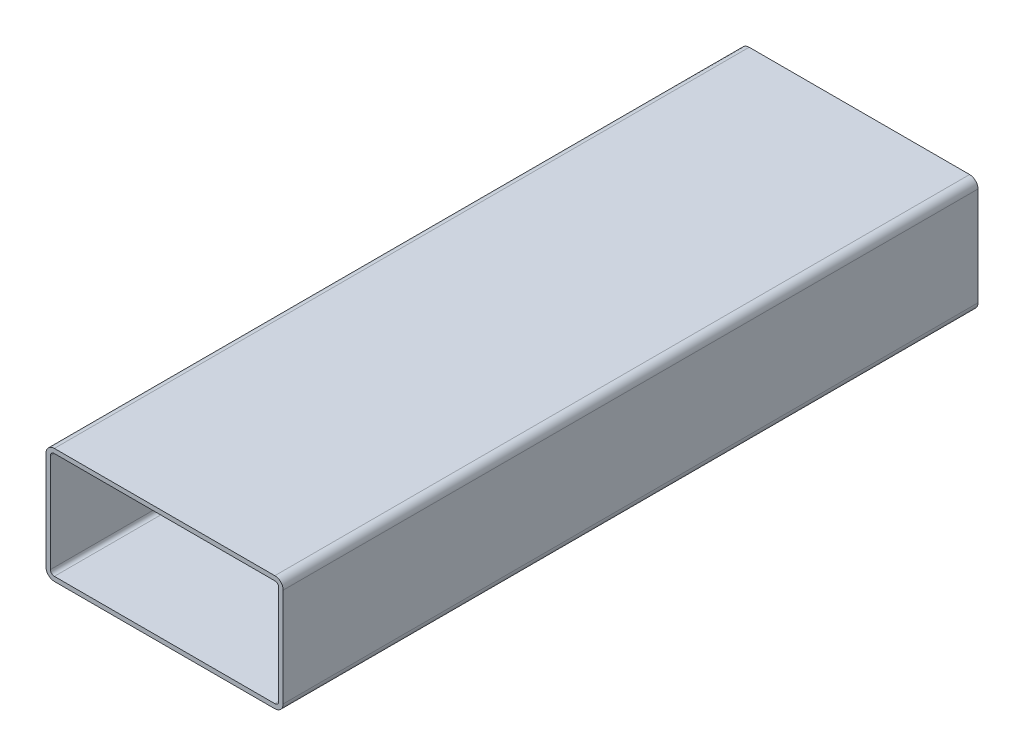
ISO-10303-21;
HEADER;
FILE_DESCRIPTION(('STEP AP214'),'2;1');
FILE_NAME('part.step','',(''),(''),'','','');
FILE_SCHEMA(('AUTOMOTIVE_DESIGN { 1 0 10303 214 1 1 1 1 }'));
ENDSEC;
DATA;
#1=APPLICATION_CONTEXT('core data for automotive mechanical design processes');
#2=APPLICATION_PROTOCOL_DEFINITION('international standard','automotive_design',2000,#1);
#3=PRODUCT_CONTEXT('',#1,'mechanical');
#4=PRODUCT('Part','Part','',(#3));
#5=PRODUCT_RELATED_PRODUCT_CATEGORY('part','',(#4));
#6=PRODUCT_DEFINITION_FORMATION('','',#4);
#7=PRODUCT_DEFINITION_CONTEXT('part definition',#1,'design');
#8=PRODUCT_DEFINITION('design','',#6,#7);
#9=PRODUCT_DEFINITION_SHAPE('','',#8);
#10=(LENGTH_UNIT() NAMED_UNIT(*) SI_UNIT(.MILLI.,.METRE.));
#11=(NAMED_UNIT(*) PLANE_ANGLE_UNIT() SI_UNIT($,.RADIAN.));
#12=(NAMED_UNIT(*) SI_UNIT($,.STERADIAN.) SOLID_ANGLE_UNIT());
#13=UNCERTAINTY_MEASURE_WITH_UNIT(LENGTH_MEASURE(1.E-05),#10,'distance_accuracy_value','');
#14=(GEOMETRIC_REPRESENTATION_CONTEXT(3) GLOBAL_UNCERTAINTY_ASSIGNED_CONTEXT((#13)) GLOBAL_UNIT_ASSIGNED_CONTEXT((#10,
#11,#12)) REPRESENTATION_CONTEXT('',''));
#15=CARTESIAN_POINT('',(0.,0.,0.));
#16=DIRECTION('',(0.,0.,1.));
#17=DIRECTION('',(1.,0.,0.));
#18=AXIS2_PLACEMENT_3D('',#15,#16,#17);
#19=CARTESIAN_POINT('',(33.,-14.75,-208.));
#20=DIRECTION('',(0.,0.,1.));
#21=DIRECTION('',(1.,0.,0.));
#22=AXIS2_PLACEMENT_3D('',#19,#20,#21);
#23=CYLINDRICAL_SURFACE('',#22,2.5);
#24=CARTESIAN_POINT('',(33.,-14.75,0.));
#25=DIRECTION('',(0.,0.,1.));
#26=DIRECTION('',(1.,0.,0.));
#27=AXIS2_PLACEMENT_3D('',#24,#25,#26);
#28=CIRCLE('',#27,2.5);
#29=CARTESIAN_POINT('',(33.,-17.25,0.));
#30=VERTEX_POINT('',#29);
#31=CARTESIAN_POINT('',(35.5,-14.75,0.));
#32=VERTEX_POINT('',#31);
#33=EDGE_CURVE('E232',#30,#32,#28,.T.);
#34=ORIENTED_EDGE('',*,*,#33,.F.);
#35=DIRECTION('',(0.,0.,1.));
#36=VECTOR('',#35,1.);
#37=CARTESIAN_POINT('',(33.,-17.25,-208.));
#38=LINE('',#37,#36);
#39=CARTESIAN_POINT('',(33.,-17.25,-208.));
#40=VERTEX_POINT('',#39);
#41=EDGE_CURVE('E11',#40,#30,#38,.T.);
#42=ORIENTED_EDGE('',*,*,#41,.F.);
#43=CARTESIAN_POINT('',(33.,-14.75,-208.));
#44=DIRECTION('',(0.,0.,1.));
#45=DIRECTION('',(1.,0.,0.));
#46=AXIS2_PLACEMENT_3D('',#43,#44,#45);
#47=CIRCLE('',#46,2.5);
#48=CARTESIAN_POINT('',(35.5,-14.75,-208.));
#49=VERTEX_POINT('',#48);
#50=EDGE_CURVE('E207',#40,#49,#47,.T.);
#51=ORIENTED_EDGE('',*,*,#50,.T.);
#52=DIRECTION('',(0.,0.,1.));
#53=VECTOR('',#52,1.);
#54=CARTESIAN_POINT('',(35.5,-14.75,-208.));
#55=LINE('',#54,#53);
#56=EDGE_CURVE('E36',#49,#32,#55,.T.);
#57=ORIENTED_EDGE('',*,*,#56,.T.);
#58=EDGE_LOOP('',(#34,#42,#51,#57));
#59=FACE_BOUND('',#58,.T.);
#60=ADVANCED_FACE('F33',(#59),#23,.T.);
#61=CARTESIAN_POINT('',(-33.,-17.25,-208.));
#62=DIRECTION('',(0.,-1.,0.));
#63=DIRECTION('',(0.,0.,-1.));
#64=AXIS2_PLACEMENT_3D('',#61,#62,#63);
#65=PLANE('',#64);
#66=DIRECTION('',(1.,0.,0.));
#67=VECTOR('',#66,1.);
#68=CARTESIAN_POINT('',(-33.,-17.25,0.));
#69=LINE('',#68,#67);
#70=CARTESIAN_POINT('',(-33.,-17.25,0.));
#71=VERTEX_POINT('',#70);
#72=EDGE_CURVE('E211',#71,#30,#69,.T.);
#73=ORIENTED_EDGE('',*,*,#72,.F.);
#74=DIRECTION('',(0.,0.,1.));
#75=VECTOR('',#74,1.);
#76=CARTESIAN_POINT('',(-33.,-17.25,-208.));
#77=LINE('',#76,#75);
#78=CARTESIAN_POINT('',(-33.,-17.25,-208.));
#79=VERTEX_POINT('',#78);
#80=EDGE_CURVE('E41',#79,#71,#77,.T.);
#81=ORIENTED_EDGE('',*,*,#80,.F.);
#82=DIRECTION('',(1.,0.,0.));
#83=VECTOR('',#82,1.);
#84=CARTESIAN_POINT('',(-33.,-17.25,-208.));
#85=LINE('',#84,#83);
#86=EDGE_CURVE('E229',#79,#40,#85,.T.);
#87=ORIENTED_EDGE('',*,*,#86,.T.);
#88=ORIENTED_EDGE('',*,*,#41,.T.);
#89=EDGE_LOOP('',(#73,#81,#87,#88));
#90=FACE_BOUND('',#89,.T.);
#91=ADVANCED_FACE('F275',(#90),#65,.T.);
#92=CARTESIAN_POINT('',(-33.,-14.75,-208.));
#93=DIRECTION('',(0.,0.,1.));
#94=DIRECTION('',(1.,0.,0.));
#95=AXIS2_PLACEMENT_3D('',#92,#93,#94);
#96=CYLINDRICAL_SURFACE('',#95,2.5);
#97=CARTESIAN_POINT('',(-33.,-14.75,0.));
#98=DIRECTION('',(0.,0.,1.));
#99=DIRECTION('',(-1.,0.,0.));
#100=AXIS2_PLACEMENT_3D('',#97,#98,#99);
#101=CIRCLE('',#100,2.5);
#102=CARTESIAN_POINT('',(-35.5,-14.75,0.));
#103=VERTEX_POINT('',#102);
#104=EDGE_CURVE('E250',#103,#71,#101,.T.);
#105=ORIENTED_EDGE('',*,*,#104,.F.);
#106=DIRECTION('',(0.,0.,1.));
#107=VECTOR('',#106,1.);
#108=CARTESIAN_POINT('',(-35.5,-14.75,-208.));
#109=LINE('',#108,#107);
#110=CARTESIAN_POINT('',(-35.5,-14.75,-208.));
#111=VERTEX_POINT('',#110);
#112=EDGE_CURVE('E256',#111,#103,#109,.T.);
#113=ORIENTED_EDGE('',*,*,#112,.F.);
#114=CARTESIAN_POINT('',(-33.,-14.75,-208.));
#115=DIRECTION('',(0.,0.,1.));
#116=DIRECTION('',(-1.,0.,0.));
#117=AXIS2_PLACEMENT_3D('',#114,#115,#116);
#118=CIRCLE('',#117,2.5);
#119=EDGE_CURVE('E226',#111,#79,#118,.T.);
#120=ORIENTED_EDGE('',*,*,#119,.T.);
#121=ORIENTED_EDGE('',*,*,#80,.T.);
#122=EDGE_LOOP('',(#105,#113,#120,#121));
#123=FACE_BOUND('',#122,.T.);
#124=ADVANCED_FACE('F296',(#123),#96,.T.);
#125=CARTESIAN_POINT('',(-35.5,-14.75,-208.));
#126=DIRECTION('',(-1.,0.,0.));
#127=DIRECTION('',(0.,0.,1.));
#128=AXIS2_PLACEMENT_3D('',#125,#126,#127);
#129=PLANE('',#128);
#130=DIRECTION('',(0.,-1.,0.));
#131=VECTOR('',#130,1.);
#132=CARTESIAN_POINT('',(-35.5,-14.75,0.));
#133=LINE('',#132,#131);
#134=CARTESIAN_POINT('',(-35.5,14.75,0.));
#135=VERTEX_POINT('',#134);
#136=EDGE_CURVE('E247',#135,#103,#133,.T.);
#137=ORIENTED_EDGE('',*,*,#136,.F.);
#138=DIRECTION('',(0.,0.,1.));
#139=VECTOR('',#138,1.);
#140=CARTESIAN_POINT('',(-35.5,14.75,-208.));
#141=LINE('',#140,#139);
#142=CARTESIAN_POINT('',(-35.5,14.75,-208.));
#143=VERTEX_POINT('',#142);
#144=EDGE_CURVE('E258',#143,#135,#141,.T.);
#145=ORIENTED_EDGE('',*,*,#144,.F.);
#146=DIRECTION('',(0.,-1.,0.));
#147=VECTOR('',#146,1.);
#148=CARTESIAN_POINT('',(-35.5,-14.75,-208.));
#149=LINE('',#148,#147);
#150=EDGE_CURVE('E223',#143,#111,#149,.T.);
#151=ORIENTED_EDGE('',*,*,#150,.T.);
#152=ORIENTED_EDGE('',*,*,#112,.T.);
#153=EDGE_LOOP('',(#137,#145,#151,#152));
#154=FACE_BOUND('',#153,.T.);
#155=ADVANCED_FACE('F294',(#154),#129,.T.);
#156=CARTESIAN_POINT('',(-33.,14.75,-208.));
#157=DIRECTION('',(0.,0.,1.));
#158=DIRECTION('',(1.,0.,0.));
#159=AXIS2_PLACEMENT_3D('',#156,#157,#158);
#160=CYLINDRICAL_SURFACE('',#159,2.5);
#161=CARTESIAN_POINT('',(-33.,14.75,0.));
#162=DIRECTION('',(0.,0.,1.));
#163=DIRECTION('',(-1.,0.,0.));
#164=AXIS2_PLACEMENT_3D('',#161,#162,#163);
#165=CIRCLE('',#164,2.5);
#166=CARTESIAN_POINT('',(-33.,17.25,0.));
#167=VERTEX_POINT('',#166);
#168=EDGE_CURVE('E244',#167,#135,#165,.T.);
#169=ORIENTED_EDGE('',*,*,#168,.F.);
#170=DIRECTION('',(0.,0.,1.));
#171=VECTOR('',#170,1.);
#172=CARTESIAN_POINT('',(-33.,17.25,-208.));
#173=LINE('',#172,#171);
#174=CARTESIAN_POINT('',(-33.,17.25,-208.));
#175=VERTEX_POINT('',#174);
#176=EDGE_CURVE('E260',#175,#167,#173,.T.);
#177=ORIENTED_EDGE('',*,*,#176,.F.);
#178=CARTESIAN_POINT('',(-33.,14.75,-208.));
#179=DIRECTION('',(0.,0.,1.));
#180=DIRECTION('',(-1.,0.,0.));
#181=AXIS2_PLACEMENT_3D('',#178,#179,#180);
#182=CIRCLE('',#181,2.5);
#183=EDGE_CURVE('E220',#175,#143,#182,.T.);
#184=ORIENTED_EDGE('',*,*,#183,.T.);
#185=ORIENTED_EDGE('',*,*,#144,.T.);
#186=EDGE_LOOP('',(#169,#177,#184,#185));
#187=FACE_BOUND('',#186,.T.);
#188=ADVANCED_FACE('F290',(#187),#160,.T.);
#189=CARTESIAN_POINT('',(-33.,17.25,-208.));
#190=DIRECTION('',(0.,1.,0.));
#191=DIRECTION('',(0.,0.,1.));
#192=AXIS2_PLACEMENT_3D('',#189,#190,#191);
#193=PLANE('',#192);
#194=DIRECTION('',(-1.,0.,0.));
#195=VECTOR('',#194,1.);
#196=CARTESIAN_POINT('',(-33.,17.25,0.));
#197=LINE('',#196,#195);
#198=CARTESIAN_POINT('',(33.,17.25,0.));
#199=VERTEX_POINT('',#198);
#200=EDGE_CURVE('E241',#199,#167,#197,.T.);
#201=ORIENTED_EDGE('',*,*,#200,.F.);
#202=DIRECTION('',(0.,0.,1.));
#203=VECTOR('',#202,1.);
#204=CARTESIAN_POINT('',(33.,17.25,-208.));
#205=LINE('',#204,#203);
#206=CARTESIAN_POINT('',(33.,17.25,-208.));
#207=VERTEX_POINT('',#206);
#208=EDGE_CURVE('E262',#207,#199,#205,.T.);
#209=ORIENTED_EDGE('',*,*,#208,.F.);
#210=DIRECTION('',(-1.,0.,0.));
#211=VECTOR('',#210,1.);
#212=CARTESIAN_POINT('',(-33.,17.25,-208.));
#213=LINE('',#212,#211);
#214=EDGE_CURVE('E217',#207,#175,#213,.T.);
#215=ORIENTED_EDGE('',*,*,#214,.T.);
#216=ORIENTED_EDGE('',*,*,#176,.T.);
#217=EDGE_LOOP('',(#201,#209,#215,#216));
#218=FACE_BOUND('',#217,.T.);
#219=ADVANCED_FACE('F288',(#218),#193,.T.);
#220=CARTESIAN_POINT('',(33.,14.75,-208.));
#221=DIRECTION('',(0.,0.,1.));
#222=DIRECTION('',(1.,0.,0.));
#223=AXIS2_PLACEMENT_3D('',#220,#221,#222);
#224=CYLINDRICAL_SURFACE('',#223,2.5);
#225=CARTESIAN_POINT('',(33.,14.75,0.));
#226=DIRECTION('',(0.,0.,1.));
#227=DIRECTION('',(-1.,0.,0.));
#228=AXIS2_PLACEMENT_3D('',#225,#226,#227);
#229=CIRCLE('',#228,2.5);
#230=CARTESIAN_POINT('',(35.5,14.75,0.));
#231=VERTEX_POINT('',#230);
#232=EDGE_CURVE('E238',#231,#199,#229,.T.);
#233=ORIENTED_EDGE('',*,*,#232,.F.);
#234=DIRECTION('',(0.,0.,1.));
#235=VECTOR('',#234,1.);
#236=CARTESIAN_POINT('',(35.5,14.75,-208.));
#237=LINE('',#236,#235);
#238=CARTESIAN_POINT('',(35.5,14.75,-208.));
#239=VERTEX_POINT('',#238);
#240=EDGE_CURVE('E263',#239,#231,#237,.T.);
#241=ORIENTED_EDGE('',*,*,#240,.F.);
#242=CARTESIAN_POINT('',(33.,14.75,-208.));
#243=DIRECTION('',(0.,0.,1.));
#244=DIRECTION('',(-1.,0.,0.));
#245=AXIS2_PLACEMENT_3D('',#242,#243,#244);
#246=CIRCLE('',#245,2.5);
#247=EDGE_CURVE('E214',#239,#207,#246,.T.);
#248=ORIENTED_EDGE('',*,*,#247,.T.);
#249=ORIENTED_EDGE('',*,*,#208,.T.);
#250=EDGE_LOOP('',(#233,#241,#248,#249));
#251=FACE_BOUND('',#250,.T.);
#252=ADVANCED_FACE('F284',(#251),#224,.T.);
#253=CARTESIAN_POINT('',(35.5,-14.75,-208.));
#254=DIRECTION('',(1.,0.,0.));
#255=DIRECTION('',(0.,0.,-1.));
#256=AXIS2_PLACEMENT_3D('',#253,#254,#255);
#257=PLANE('',#256);
#258=DIRECTION('',(0.,1.,0.));
#259=VECTOR('',#258,1.);
#260=CARTESIAN_POINT('',(35.5,-14.75,0.));
#261=LINE('',#260,#259);
#262=EDGE_CURVE('E235',#32,#231,#261,.T.);
#263=ORIENTED_EDGE('',*,*,#262,.F.);
#264=ORIENTED_EDGE('',*,*,#56,.F.);
#265=DIRECTION('',(0.,1.,0.));
#266=VECTOR('',#265,1.);
#267=CARTESIAN_POINT('',(35.5,-14.75,-208.));
#268=LINE('',#267,#266);
#269=EDGE_CURVE('E210',#49,#239,#268,.T.);
#270=ORIENTED_EDGE('',*,*,#269,.T.);
#271=ORIENTED_EDGE('',*,*,#240,.T.);
#272=EDGE_LOOP('',(#263,#264,#270,#271));
#273=FACE_BOUND('',#272,.T.);
#274=ADVANCED_FACE('F271',(#273),#257,.T.);
#275=CARTESIAN_POINT('',(33.,-14.75,-208.));
#276=DIRECTION('',(0.,0.,1.));
#277=DIRECTION('',(1.,0.,0.));
#278=AXIS2_PLACEMENT_3D('',#275,#276,#277);
#279=PLANE('',#278);
#280=DIRECTION('',(1.,0.,0.));
#281=VECTOR('',#280,1.);
#282=CARTESIAN_POINT('',(33.,-15.92,-208.));
#283=LINE('',#282,#281);
#284=CARTESIAN_POINT('',(-33.,-15.92,-208.));
#285=VERTEX_POINT('',#284);
#286=CARTESIAN_POINT('',(33.,-15.92,-208.));
#287=VERTEX_POINT('',#286);
#288=EDGE_CURVE('E158',#285,#287,#283,.T.);
#289=ORIENTED_EDGE('',*,*,#288,.T.);
#290=CARTESIAN_POINT('',(33.,-14.75,-208.));
#291=DIRECTION('',(0.,0.,1.));
#292=DIRECTION('',(1.,0.,0.));
#293=AXIS2_PLACEMENT_3D('',#290,#291,#292);
#294=CIRCLE('',#293,1.17);
#295=CARTESIAN_POINT('',(34.17,-14.75,-208.));
#296=VERTEX_POINT('',#295);
#297=EDGE_CURVE('E189',#287,#296,#294,.T.);
#298=ORIENTED_EDGE('',*,*,#297,.T.);
#299=DIRECTION('',(0.,1.,0.));
#300=VECTOR('',#299,1.);
#301=CARTESIAN_POINT('',(34.17,-14.75,-208.));
#302=LINE('',#301,#300);
#303=CARTESIAN_POINT('',(34.17,14.75,-208.));
#304=VERTEX_POINT('',#303);
#305=EDGE_CURVE('E153',#296,#304,#302,.T.);
#306=ORIENTED_EDGE('',*,*,#305,.T.);
#307=CARTESIAN_POINT('',(33.,14.75,-208.));
#308=DIRECTION('',(0.,0.,1.));
#309=DIRECTION('',(1.,0.,0.));
#310=AXIS2_PLACEMENT_3D('',#307,#308,#309);
#311=CIRCLE('',#310,1.17);
#312=CARTESIAN_POINT('',(33.,15.92,-208.));
#313=VERTEX_POINT('',#312);
#314=EDGE_CURVE('E49',#304,#313,#311,.T.);
#315=ORIENTED_EDGE('',*,*,#314,.T.);
#316=DIRECTION('',(-1.,0.,0.));
#317=VECTOR('',#316,1.);
#318=CARTESIAN_POINT('',(33.,15.92,-208.));
#319=LINE('',#318,#317);
#320=CARTESIAN_POINT('',(-33.,15.92,-208.));
#321=VERTEX_POINT('',#320);
#322=EDGE_CURVE('E202',#313,#321,#319,.T.);
#323=ORIENTED_EDGE('',*,*,#322,.T.);
#324=CARTESIAN_POINT('',(-33.,14.75,-208.));
#325=DIRECTION('',(0.,0.,1.));
#326=DIRECTION('',(1.,0.,0.));
#327=AXIS2_PLACEMENT_3D('',#324,#325,#326);
#328=CIRCLE('',#327,1.17);
#329=CARTESIAN_POINT('',(-34.17,14.75,-208.));
#330=VERTEX_POINT('',#329);
#331=EDGE_CURVE('E199',#321,#330,#328,.T.);
#332=ORIENTED_EDGE('',*,*,#331,.T.);
#333=DIRECTION('',(0.,-1.,0.));
#334=VECTOR('',#333,1.);
#335=CARTESIAN_POINT('',(-34.17,-14.75,-208.));
#336=LINE('',#335,#334);
#337=CARTESIAN_POINT('',(-34.17,-14.75,-208.));
#338=VERTEX_POINT('',#337);
#339=EDGE_CURVE('E196',#330,#338,#336,.T.);
#340=ORIENTED_EDGE('',*,*,#339,.T.);
#341=CARTESIAN_POINT('',(-33.,-14.75,-208.));
#342=DIRECTION('',(0.,0.,1.));
#343=DIRECTION('',(1.,0.,0.));
#344=AXIS2_PLACEMENT_3D('',#341,#342,#343);
#345=CIRCLE('',#344,1.17);
#346=EDGE_CURVE('E193',#338,#285,#345,.T.);
#347=ORIENTED_EDGE('',*,*,#346,.T.);
#348=EDGE_LOOP('',(#289,#298,#306,#315,#323,#332,#340,#347));
#349=FACE_BOUND('',#348,.T.);
#350=ORIENTED_EDGE('',*,*,#50,.F.);
#351=ORIENTED_EDGE('',*,*,#86,.F.);
#352=ORIENTED_EDGE('',*,*,#119,.F.);
#353=ORIENTED_EDGE('',*,*,#150,.F.);
#354=ORIENTED_EDGE('',*,*,#183,.F.);
#355=ORIENTED_EDGE('',*,*,#214,.F.);
#356=ORIENTED_EDGE('',*,*,#247,.F.);
#357=ORIENTED_EDGE('',*,*,#269,.F.);
#358=EDGE_LOOP('',(#350,#351,#352,#353,#354,#355,#356,#357));
#359=FACE_BOUND('',#358,.T.);
#360=ADVANCED_FACE('F278',(#349,#359),#279,.F.);
#361=CARTESIAN_POINT('',(33.,-14.75,0.));
#362=DIRECTION('',(0.,0.,1.));
#363=DIRECTION('',(1.,0.,0.));
#364=AXIS2_PLACEMENT_3D('',#361,#362,#363);
#365=PLANE('',#364);
#366=CARTESIAN_POINT('',(33.,-14.75,0.));
#367=DIRECTION('',(0.,0.,1.));
#368=DIRECTION('',(1.,0.,0.));
#369=AXIS2_PLACEMENT_3D('',#366,#367,#368);
#370=CIRCLE('',#369,1.17);
#371=CARTESIAN_POINT('',(33.,-15.92,0.));
#372=VERTEX_POINT('',#371);
#373=CARTESIAN_POINT('',(34.17,-14.75,0.));
#374=VERTEX_POINT('',#373);
#375=EDGE_CURVE('E161',#372,#374,#370,.T.);
#376=ORIENTED_EDGE('',*,*,#375,.F.);
#377=DIRECTION('',(1.,0.,0.));
#378=VECTOR('',#377,1.);
#379=CARTESIAN_POINT('',(33.,-15.92,0.));
#380=LINE('',#379,#378);
#381=CARTESIAN_POINT('',(-33.,-15.92,0.));
#382=VERTEX_POINT('',#381);
#383=EDGE_CURVE('E187',#382,#372,#380,.T.);
#384=ORIENTED_EDGE('',*,*,#383,.F.);
#385=CARTESIAN_POINT('',(-33.,-14.75,0.));
#386=DIRECTION('',(0.,0.,1.));
#387=DIRECTION('',(1.,0.,0.));
#388=AXIS2_PLACEMENT_3D('',#385,#386,#387);
#389=CIRCLE('',#388,1.17);
#390=CARTESIAN_POINT('',(-34.17,-14.75,0.));
#391=VERTEX_POINT('',#390);
#392=EDGE_CURVE('E57',#391,#382,#389,.T.);
#393=ORIENTED_EDGE('',*,*,#392,.F.);
#394=DIRECTION('',(0.,-1.,0.));
#395=VECTOR('',#394,1.);
#396=CARTESIAN_POINT('',(-34.17,-14.75,0.));
#397=LINE('',#396,#395);
#398=CARTESIAN_POINT('',(-34.17,14.75,0.));
#399=VERTEX_POINT('',#398);
#400=EDGE_CURVE('E183',#399,#391,#397,.T.);
#401=ORIENTED_EDGE('',*,*,#400,.F.);
#402=CARTESIAN_POINT('',(-33.,14.75,0.));
#403=DIRECTION('',(0.,0.,1.));
#404=DIRECTION('',(1.,0.,0.));
#405=AXIS2_PLACEMENT_3D('',#402,#403,#404);
#406=CIRCLE('',#405,1.17);
#407=CARTESIAN_POINT('',(-33.,15.92,0.));
#408=VERTEX_POINT('',#407);
#409=EDGE_CURVE('E180',#408,#399,#406,.T.);
#410=ORIENTED_EDGE('',*,*,#409,.F.);
#411=DIRECTION('',(-1.,0.,0.));
#412=VECTOR('',#411,1.);
#413=CARTESIAN_POINT('',(33.,15.92,0.));
#414=LINE('',#413,#412);
#415=CARTESIAN_POINT('',(33.,15.92,0.));
#416=VERTEX_POINT('',#415);
#417=EDGE_CURVE('E174',#416,#408,#414,.T.);
#418=ORIENTED_EDGE('',*,*,#417,.F.);
#419=CARTESIAN_POINT('',(33.,14.75,0.));
#420=DIRECTION('',(0.,0.,1.));
#421=DIRECTION('',(1.,0.,0.));
#422=AXIS2_PLACEMENT_3D('',#419,#420,#421);
#423=CIRCLE('',#422,1.17);
#424=CARTESIAN_POINT('',(34.17,14.75,0.));
#425=VERTEX_POINT('',#424);
#426=EDGE_CURVE('E172',#425,#416,#423,.T.);
#427=ORIENTED_EDGE('',*,*,#426,.F.);
#428=DIRECTION('',(0.,1.,0.));
#429=VECTOR('',#428,1.);
#430=CARTESIAN_POINT('',(34.17,-14.75,0.));
#431=LINE('',#430,#429);
#432=EDGE_CURVE('E150',#374,#425,#431,.T.);
#433=ORIENTED_EDGE('',*,*,#432,.F.);
#434=EDGE_LOOP('',(#376,#384,#393,#401,#410,#418,#427,#433));
#435=FACE_BOUND('',#434,.T.);
#436=ORIENTED_EDGE('',*,*,#33,.T.);
#437=ORIENTED_EDGE('',*,*,#262,.T.);
#438=ORIENTED_EDGE('',*,*,#232,.T.);
#439=ORIENTED_EDGE('',*,*,#200,.T.);
#440=ORIENTED_EDGE('',*,*,#168,.T.);
#441=ORIENTED_EDGE('',*,*,#136,.T.);
#442=ORIENTED_EDGE('',*,*,#104,.T.);
#443=ORIENTED_EDGE('',*,*,#72,.T.);
#444=EDGE_LOOP('',(#436,#437,#438,#439,#440,#441,#442,#443));
#445=FACE_BOUND('',#444,.T.);
#446=ADVANCED_FACE('F168',(#435,#445),#365,.T.);
#447=CARTESIAN_POINT('',(33.,-14.75,-208.));
#448=DIRECTION('',(0.,0.,1.));
#449=DIRECTION('',(1.,0.,0.));
#450=AXIS2_PLACEMENT_3D('',#447,#448,#449);
#451=CYLINDRICAL_SURFACE('',#450,1.17);
#452=ORIENTED_EDGE('',*,*,#375,.T.);
#453=DIRECTION('',(0.,0.,1.));
#454=VECTOR('',#453,1.);
#455=CARTESIAN_POINT('',(34.17,-14.75,-208.));
#456=LINE('',#455,#454);
#457=EDGE_CURVE('E146',#296,#374,#456,.T.);
#458=ORIENTED_EDGE('',*,*,#457,.F.);
#459=ORIENTED_EDGE('',*,*,#297,.F.);
#460=DIRECTION('',(0.,0.,-1.));
#461=VECTOR('',#460,1.);
#462=CARTESIAN_POINT('',(33.,-15.92,-208.));
#463=LINE('',#462,#461);
#464=EDGE_CURVE('E163',#287,#372,#463,.F.);
#465=ORIENTED_EDGE('',*,*,#464,.T.);
#466=EDGE_LOOP('',(#452,#458,#459,#465));
#467=FACE_BOUND('',#466,.T.);
#468=ADVANCED_FACE('F162',(#467),#451,.F.);
#469=CARTESIAN_POINT('',(-33.,-15.92,-208.));
#470=DIRECTION('',(0.,-1.,0.));
#471=DIRECTION('',(0.,0.,-1.));
#472=AXIS2_PLACEMENT_3D('',#469,#470,#471);
#473=PLANE('',#472);
#474=ORIENTED_EDGE('',*,*,#383,.T.);
#475=ORIENTED_EDGE('',*,*,#464,.F.);
#476=ORIENTED_EDGE('',*,*,#288,.F.);
#477=DIRECTION('',(0.,0.,1.));
#478=VECTOR('',#477,1.);
#479=CARTESIAN_POINT('',(-33.,-15.92,-208.));
#480=LINE('',#479,#478);
#481=EDGE_CURVE('E461',#285,#382,#480,.T.);
#482=ORIENTED_EDGE('',*,*,#481,.T.);
#483=EDGE_LOOP('',(#474,#475,#476,#482));
#484=FACE_BOUND('',#483,.T.);
#485=ADVANCED_FACE('F379',(#484),#473,.F.);
#486=CARTESIAN_POINT('',(-33.,-14.75,-208.));
#487=DIRECTION('',(0.,0.,1.));
#488=DIRECTION('',(1.,0.,0.));
#489=AXIS2_PLACEMENT_3D('',#486,#487,#488);
#490=CYLINDRICAL_SURFACE('',#489,1.17);
#491=ORIENTED_EDGE('',*,*,#392,.T.);
#492=ORIENTED_EDGE('',*,*,#481,.F.);
#493=ORIENTED_EDGE('',*,*,#346,.F.);
#494=DIRECTION('',(0.,0.,1.));
#495=VECTOR('',#494,1.);
#496=CARTESIAN_POINT('',(-34.17,-14.75,-208.));
#497=LINE('',#496,#495);
#498=EDGE_CURVE('E459',#338,#391,#497,.T.);
#499=ORIENTED_EDGE('',*,*,#498,.T.);
#500=EDGE_LOOP('',(#491,#492,#493,#499));
#501=FACE_BOUND('',#500,.T.);
#502=ADVANCED_FACE('F388',(#501),#490,.F.);
#503=CARTESIAN_POINT('',(-34.17,-14.75,-208.));
#504=DIRECTION('',(-1.,0.,0.));
#505=DIRECTION('',(0.,0.,1.));
#506=AXIS2_PLACEMENT_3D('',#503,#504,#505);
#507=PLANE('',#506);
#508=ORIENTED_EDGE('',*,*,#400,.T.);
#509=ORIENTED_EDGE('',*,*,#498,.F.);
#510=ORIENTED_EDGE('',*,*,#339,.F.);
#511=DIRECTION('',(0.,0.,1.));
#512=VECTOR('',#511,1.);
#513=CARTESIAN_POINT('',(-34.17,14.75,-208.));
#514=LINE('',#513,#512);
#515=EDGE_CURVE('E455',#330,#399,#514,.T.);
#516=ORIENTED_EDGE('',*,*,#515,.T.);
#517=EDGE_LOOP('',(#508,#509,#510,#516));
#518=FACE_BOUND('',#517,.T.);
#519=ADVANCED_FACE('F398',(#518),#507,.F.);
#520=CARTESIAN_POINT('',(-33.,14.75,-208.));
#521=DIRECTION('',(0.,0.,1.));
#522=DIRECTION('',(1.,0.,0.));
#523=AXIS2_PLACEMENT_3D('',#520,#521,#522);
#524=CYLINDRICAL_SURFACE('',#523,1.17);
#525=ORIENTED_EDGE('',*,*,#409,.T.);
#526=ORIENTED_EDGE('',*,*,#515,.F.);
#527=ORIENTED_EDGE('',*,*,#331,.F.);
#528=DIRECTION('',(0.,0.,1.));
#529=VECTOR('',#528,1.);
#530=CARTESIAN_POINT('',(-33.,15.92,-208.));
#531=LINE('',#530,#529);
#532=EDGE_CURVE('E452',#321,#408,#531,.T.);
#533=ORIENTED_EDGE('',*,*,#532,.T.);
#534=EDGE_LOOP('',(#525,#526,#527,#533));
#535=FACE_BOUND('',#534,.T.);
#536=ADVANCED_FACE('F407',(#535),#524,.F.);
#537=CARTESIAN_POINT('',(-33.,15.92,-208.));
#538=DIRECTION('',(0.,1.,0.));
#539=DIRECTION('',(0.,0.,1.));
#540=AXIS2_PLACEMENT_3D('',#537,#538,#539);
#541=PLANE('',#540);
#542=ORIENTED_EDGE('',*,*,#417,.T.);
#543=ORIENTED_EDGE('',*,*,#532,.F.);
#544=ORIENTED_EDGE('',*,*,#322,.F.);
#545=DIRECTION('',(0.,0.,1.));
#546=VECTOR('',#545,1.);
#547=CARTESIAN_POINT('',(33.,15.92,-208.));
#548=LINE('',#547,#546);
#549=EDGE_CURVE('E448',#313,#416,#548,.T.);
#550=ORIENTED_EDGE('',*,*,#549,.T.);
#551=EDGE_LOOP('',(#542,#543,#544,#550));
#552=FACE_BOUND('',#551,.T.);
#553=ADVANCED_FACE('F417',(#552),#541,.F.);
#554=CARTESIAN_POINT('',(33.,14.75,-208.));
#555=DIRECTION('',(0.,0.,1.));
#556=DIRECTION('',(1.,0.,0.));
#557=AXIS2_PLACEMENT_3D('',#554,#555,#556);
#558=CYLINDRICAL_SURFACE('',#557,1.17);
#559=ORIENTED_EDGE('',*,*,#426,.T.);
#560=ORIENTED_EDGE('',*,*,#549,.F.);
#561=ORIENTED_EDGE('',*,*,#314,.F.);
#562=DIRECTION('',(0.,0.,-1.));
#563=VECTOR('',#562,1.);
#564=CARTESIAN_POINT('',(34.17,14.75,-208.));
#565=LINE('',#564,#563);
#566=EDGE_CURVE('E157',#304,#425,#565,.F.);
#567=ORIENTED_EDGE('',*,*,#566,.T.);
#568=EDGE_LOOP('',(#559,#560,#561,#567));
#569=FACE_BOUND('',#568,.T.);
#570=ADVANCED_FACE('F427',(#569),#558,.F.);
#571=CARTESIAN_POINT('',(34.17,-14.75,-208.));
#572=DIRECTION('',(1.,0.,0.));
#573=DIRECTION('',(0.,0.,-1.));
#574=AXIS2_PLACEMENT_3D('',#571,#572,#573);
#575=PLANE('',#574);
#576=ORIENTED_EDGE('',*,*,#432,.T.);
#577=ORIENTED_EDGE('',*,*,#566,.F.);
#578=ORIENTED_EDGE('',*,*,#305,.F.);
#579=ORIENTED_EDGE('',*,*,#457,.T.);
#580=EDGE_LOOP('',(#576,#577,#578,#579));
#581=FACE_BOUND('',#580,.T.);
#582=ADVANCED_FACE('F148',(#581),#575,.F.);
#583=CLOSED_SHELL('',(#60,#91,#124,#155,#188,#219,#252,#274,#360,#446,#468,#485,#502,#519,#536,
#553,#570,#582));
#584=MANIFOLD_SOLID_BREP('B2',#583);
#585=ADVANCED_BREP_SHAPE_REPRESENTATION('',(#18,#584),#14);
#586=SHAPE_DEFINITION_REPRESENTATION(#9,#585);
ENDSEC;
END-ISO-10303-21;
